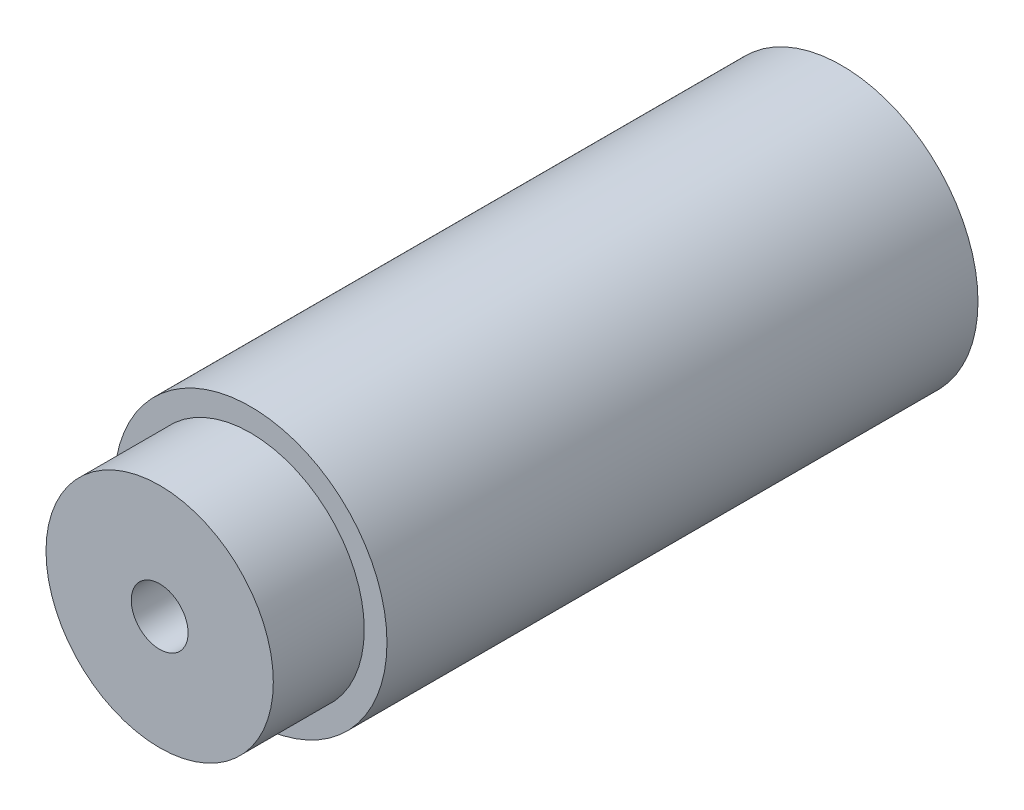
ISO-10303-21;
HEADER;
FILE_DESCRIPTION(('STEP AP214'),'2;1');
FILE_NAME('part.step','',(''),(''),'','','');
FILE_SCHEMA(('AUTOMOTIVE_DESIGN { 1 0 10303 214 1 1 1 1 }'));
ENDSEC;
DATA;
#1=APPLICATION_CONTEXT('core data for automotive mechanical design processes');
#2=APPLICATION_PROTOCOL_DEFINITION('international standard','automotive_design',2000,#1);
#3=PRODUCT_CONTEXT('',#1,'mechanical');
#4=PRODUCT('Part','Part','',(#3));
#5=PRODUCT_RELATED_PRODUCT_CATEGORY('part','',(#4));
#6=PRODUCT_DEFINITION_FORMATION('','',#4);
#7=PRODUCT_DEFINITION_CONTEXT('part definition',#1,'design');
#8=PRODUCT_DEFINITION('design','',#6,#7);
#9=PRODUCT_DEFINITION_SHAPE('','',#8);
#10=(LENGTH_UNIT() NAMED_UNIT(*) SI_UNIT(.MILLI.,.METRE.));
#11=(NAMED_UNIT(*) PLANE_ANGLE_UNIT() SI_UNIT($,.RADIAN.));
#12=(NAMED_UNIT(*) SI_UNIT($,.STERADIAN.) SOLID_ANGLE_UNIT());
#13=UNCERTAINTY_MEASURE_WITH_UNIT(LENGTH_MEASURE(1.E-05),#10,'distance_accuracy_value','');
#14=(GEOMETRIC_REPRESENTATION_CONTEXT(3) GLOBAL_UNCERTAINTY_ASSIGNED_CONTEXT((#13)) GLOBAL_UNIT_ASSIGNED_CONTEXT((#10,
#11,#12)) REPRESENTATION_CONTEXT('',''));
#15=CARTESIAN_POINT('',(0.,0.,0.));
#16=DIRECTION('',(0.,0.,1.));
#17=DIRECTION('',(1.,0.,0.));
#18=AXIS2_PLACEMENT_3D('',#15,#16,#17);
#19=CARTESIAN_POINT('',(0.,0.,30.));
#20=DIRECTION('',(0.,0.,-1.));
#21=DIRECTION('',(-1.,0.,0.));
#22=AXIS2_PLACEMENT_3D('',#19,#20,#21);
#23=CYLINDRICAL_SURFACE('',#22,6.);
#24=CARTESIAN_POINT('',(0.,0.,0.));
#25=DIRECTION('',(0.,0.,1.));
#26=DIRECTION('',(1.,0.,0.));
#27=AXIS2_PLACEMENT_3D('',#24,#25,#26);
#28=CIRCLE('',#27,6.);
#29=CARTESIAN_POINT('',(6.,0.,0.));
#30=VERTEX_POINT('',#29);
#31=EDGE_CURVE('E10',#30,#30,#28,.T.);
#32=ORIENTED_EDGE('',*,*,#31,.T.);
#33=EDGE_LOOP('',(#32));
#34=FACE_BOUND('',#33,.T.);
#35=CARTESIAN_POINT('',(0.,0.,26.));
#36=DIRECTION('',(0.,0.,1.));
#37=DIRECTION('',(1.,0.,0.));
#38=AXIS2_PLACEMENT_3D('',#35,#36,#37);
#39=CIRCLE('',#38,6.);
#40=CARTESIAN_POINT('',(6.,0.,26.));
#41=VERTEX_POINT('',#40);
#42=EDGE_CURVE('E44',#41,#41,#39,.T.);
#43=ORIENTED_EDGE('',*,*,#42,.F.);
#44=EDGE_LOOP('',(#43));
#45=FACE_BOUND('',#44,.T.);
#46=ADVANCED_FACE('F37',(#34,#45),#23,.T.);
#47=CARTESIAN_POINT('',(0.,0.,0.));
#48=DIRECTION('',(0.,0.,1.));
#49=DIRECTION('',(1.,0.,0.));
#50=AXIS2_PLACEMENT_3D('',#47,#48,#49);
#51=PLANE('',#50);
#52=ORIENTED_EDGE('',*,*,#31,.F.);
#53=EDGE_LOOP('',(#52));
#54=FACE_BOUND('',#53,.T.);
#55=ADVANCED_FACE('F91',(#54),#51,.F.);
#56=CARTESIAN_POINT('',(0.,0.,26.));
#57=DIRECTION('',(0.,0.,1.));
#58=DIRECTION('',(1.,0.,0.));
#59=AXIS2_PLACEMENT_3D('',#56,#57,#58);
#60=PLANE('',#59);
#61=CARTESIAN_POINT('',(0.,0.,26.));
#62=DIRECTION('',(0.,0.,1.));
#63=DIRECTION('',(1.,0.,0.));
#64=AXIS2_PLACEMENT_3D('',#61,#62,#63);
#65=CIRCLE('',#64,5.);
#66=CARTESIAN_POINT('',(5.,0.,26.));
#67=VERTEX_POINT('',#66);
#68=EDGE_CURVE('E49',#67,#67,#65,.T.);
#69=ORIENTED_EDGE('',*,*,#68,.F.);
#70=EDGE_LOOP('',(#69));
#71=FACE_BOUND('',#70,.T.);
#72=ORIENTED_EDGE('',*,*,#42,.T.);
#73=EDGE_LOOP('',(#72));
#74=FACE_BOUND('',#73,.T.);
#75=ADVANCED_FACE('F85',(#71,#74),#60,.T.);
#76=CARTESIAN_POINT('',(0.,0.,26.));
#77=DIRECTION('',(0.,0.,1.));
#78=DIRECTION('',(1.,0.,0.));
#79=AXIS2_PLACEMENT_3D('',#76,#77,#78);
#80=CYLINDRICAL_SURFACE('',#79,5.);
#81=ORIENTED_EDGE('',*,*,#68,.T.);
#82=EDGE_LOOP('',(#81));
#83=FACE_BOUND('',#82,.T.);
#84=CARTESIAN_POINT('',(0.,0.,30.));
#85=DIRECTION('',(0.,0.,1.));
#86=DIRECTION('',(1.,0.,0.));
#87=AXIS2_PLACEMENT_3D('',#84,#85,#86);
#88=CIRCLE('',#87,5.);
#89=CARTESIAN_POINT('',(5.,0.,30.));
#90=VERTEX_POINT('',#89);
#91=EDGE_CURVE('E54',#90,#90,#88,.T.);
#92=ORIENTED_EDGE('',*,*,#91,.F.);
#93=EDGE_LOOP('',(#92));
#94=FACE_BOUND('',#93,.T.);
#95=ADVANCED_FACE('F80',(#83,#94),#80,.T.);
#96=CARTESIAN_POINT('',(0.,0.,30.));
#97=DIRECTION('',(0.,0.,1.));
#98=DIRECTION('',(1.,0.,0.));
#99=AXIS2_PLACEMENT_3D('',#96,#97,#98);
#100=PLANE('',#99);
#101=CARTESIAN_POINT('',(0.,0.,30.));
#102=DIRECTION('',(0.,0.,1.));
#103=DIRECTION('',(1.,0.,0.));
#104=AXIS2_PLACEMENT_3D('',#101,#102,#103);
#105=CIRCLE('',#104,1.25);
#106=CARTESIAN_POINT('',(1.25,0.,30.));
#107=VERTEX_POINT('',#106);
#108=EDGE_CURVE('E61',#107,#107,#105,.T.);
#109=ORIENTED_EDGE('',*,*,#108,.F.);
#110=EDGE_LOOP('',(#109));
#111=FACE_BOUND('',#110,.T.);
#112=ORIENTED_EDGE('',*,*,#91,.T.);
#113=EDGE_LOOP('',(#112));
#114=FACE_BOUND('',#113,.T.);
#115=ADVANCED_FACE('F74',(#111,#114),#100,.T.);
#116=CARTESIAN_POINT('',(0.,0.,20.));
#117=DIRECTION('',(0.,0.,1.));
#118=DIRECTION('',(1.,0.,0.));
#119=AXIS2_PLACEMENT_3D('',#116,#117,#118);
#120=CYLINDRICAL_SURFACE('',#119,1.25);
#121=CARTESIAN_POINT('',(0.,0.,20.));
#122=DIRECTION('',(0.,0.,1.));
#123=DIRECTION('',(1.,0.,0.));
#124=AXIS2_PLACEMENT_3D('',#121,#122,#123);
#125=CIRCLE('',#124,1.25);
#126=CARTESIAN_POINT('',(1.25,0.,20.));
#127=VERTEX_POINT('',#126);
#128=EDGE_CURVE('E59',#127,#127,#125,.T.);
#129=ORIENTED_EDGE('',*,*,#128,.F.);
#130=EDGE_LOOP('',(#129));
#131=FACE_BOUND('',#130,.T.);
#132=ORIENTED_EDGE('',*,*,#108,.T.);
#133=EDGE_LOOP('',(#132));
#134=FACE_BOUND('',#133,.T.);
#135=ADVANCED_FACE('F71',(#131,#134),#120,.F.);
#136=CARTESIAN_POINT('',(0.,0.,20.));
#137=DIRECTION('',(0.,0.,1.));
#138=DIRECTION('',(1.,0.,0.));
#139=AXIS2_PLACEMENT_3D('',#136,#137,#138);
#140=PLANE('',#139);
#141=ORIENTED_EDGE('',*,*,#128,.T.);
#142=EDGE_LOOP('',(#141));
#143=FACE_BOUND('',#142,.T.);
#144=ADVANCED_FACE('F69',(#143),#140,.T.);
#145=CLOSED_SHELL('',(#46,#55,#75,#95,#115,#135,#144));
#146=MANIFOLD_SOLID_BREP('B2',#145);
#147=ADVANCED_BREP_SHAPE_REPRESENTATION('',(#18,#146),#14);
#148=SHAPE_DEFINITION_REPRESENTATION(#9,#147);
ENDSEC;
END-ISO-10303-21;
